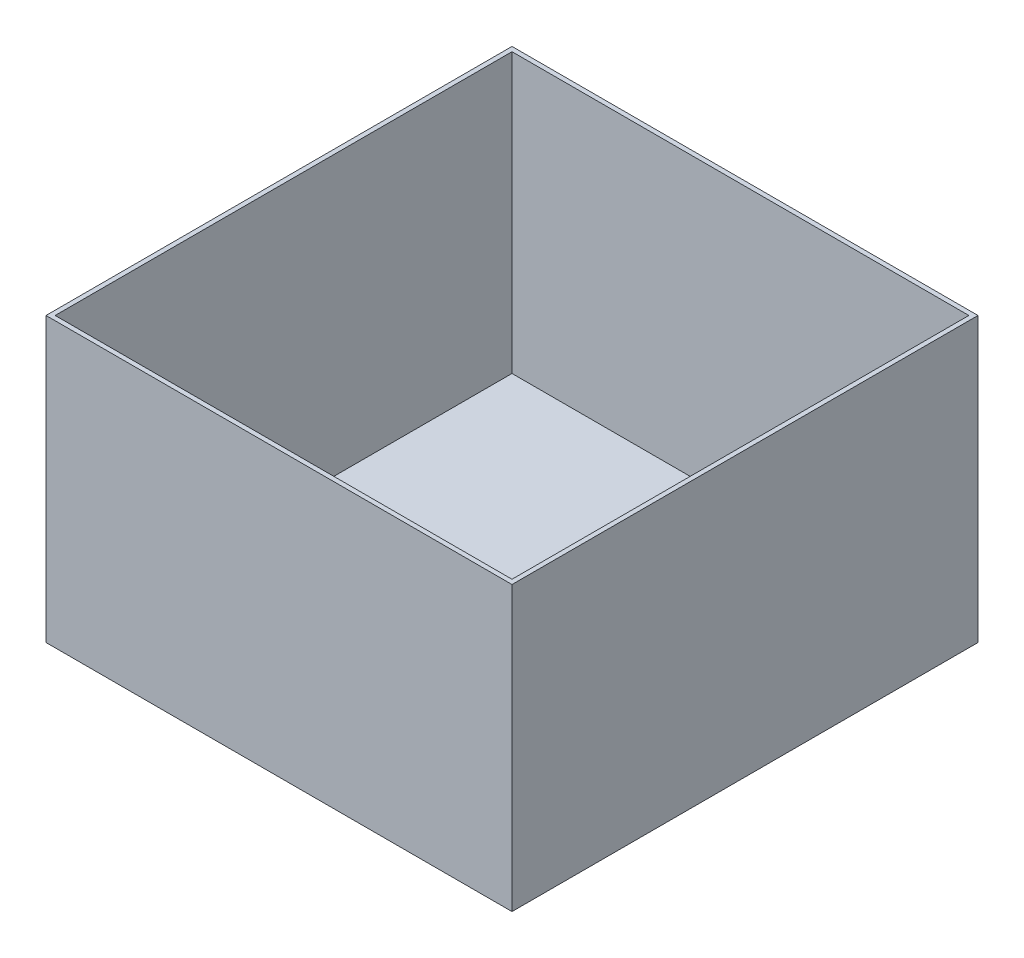
ISO-10303-21;
HEADER;
FILE_DESCRIPTION(('STEP AP214'),'2;1');
FILE_NAME('part.step','',(''),(''),'','','');
FILE_SCHEMA(('AUTOMOTIVE_DESIGN { 1 0 10303 214 1 1 1 1 }'));
ENDSEC;
DATA;
#1=APPLICATION_CONTEXT('core data for automotive mechanical design processes');
#2=APPLICATION_PROTOCOL_DEFINITION('international standard','automotive_design',2000,#1);
#3=PRODUCT_CONTEXT('',#1,'mechanical');
#4=PRODUCT('Part','Part','',(#3));
#5=PRODUCT_RELATED_PRODUCT_CATEGORY('part','',(#4));
#6=PRODUCT_DEFINITION_FORMATION('','',#4);
#7=PRODUCT_DEFINITION_CONTEXT('part definition',#1,'design');
#8=PRODUCT_DEFINITION('design','',#6,#7);
#9=PRODUCT_DEFINITION_SHAPE('','',#8);
#10=(LENGTH_UNIT() NAMED_UNIT(*) SI_UNIT(.MILLI.,.METRE.));
#11=(NAMED_UNIT(*) PLANE_ANGLE_UNIT() SI_UNIT($,.RADIAN.));
#12=(NAMED_UNIT(*) SI_UNIT($,.STERADIAN.) SOLID_ANGLE_UNIT());
#13=UNCERTAINTY_MEASURE_WITH_UNIT(LENGTH_MEASURE(1.E-05),#10,'distance_accuracy_value','');
#14=(GEOMETRIC_REPRESENTATION_CONTEXT(3) GLOBAL_UNCERTAINTY_ASSIGNED_CONTEXT((#13)) GLOBAL_UNIT_ASSIGNED_CONTEXT((#10,
#11,#12)) REPRESENTATION_CONTEXT('',''));
#15=CARTESIAN_POINT('',(0.,0.,0.));
#16=DIRECTION('',(0.,0.,1.));
#17=DIRECTION('',(1.,0.,0.));
#18=AXIS2_PLACEMENT_3D('',#15,#16,#17);
#19=CARTESIAN_POINT('',(0.,31.,0.));
#20=DIRECTION('',(0.,-1.,0.));
#21=DIRECTION('',(0.,0.,-1.));
#22=AXIS2_PLACEMENT_3D('',#19,#20,#21);
#23=PLANE('',#22);
#24=DIRECTION('',(0.,0.,-1.));
#25=VECTOR('',#24,1.);
#26=CARTESIAN_POINT('',(51.,31.,51.));
#27=LINE('',#26,#25);
#28=CARTESIAN_POINT('',(51.,31.,51.));
#29=VERTEX_POINT('',#28);
#30=CARTESIAN_POINT('',(51.,31.,-51.));
#31=VERTEX_POINT('',#30);
#32=EDGE_CURVE('E147',#29,#31,#27,.T.);
#33=ORIENTED_EDGE('',*,*,#32,.T.);
#34=DIRECTION('',(-1.,0.,0.));
#35=VECTOR('',#34,1.);
#36=CARTESIAN_POINT('',(-51.,31.,-51.));
#37=LINE('',#36,#35);
#38=CARTESIAN_POINT('',(-51.,31.,-51.));
#39=VERTEX_POINT('',#38);
#40=EDGE_CURVE('E91',#31,#39,#37,.T.);
#41=ORIENTED_EDGE('',*,*,#40,.T.);
#42=DIRECTION('',(0.,0.,1.));
#43=VECTOR('',#42,1.);
#44=CARTESIAN_POINT('',(-51.,31.,51.));
#45=LINE('',#44,#43);
#46=CARTESIAN_POINT('',(-51.,31.,51.));
#47=VERTEX_POINT('',#46);
#48=EDGE_CURVE('E150',#39,#47,#45,.T.);
#49=ORIENTED_EDGE('',*,*,#48,.T.);
#50=DIRECTION('',(1.,0.,0.));
#51=VECTOR('',#50,1.);
#52=CARTESIAN_POINT('',(-51.,31.,51.));
#53=LINE('',#52,#51);
#54=EDGE_CURVE('E63',#47,#29,#53,.T.);
#55=ORIENTED_EDGE('',*,*,#54,.T.);
#56=EDGE_LOOP('',(#33,#41,#49,#55));
#57=FACE_BOUND('',#56,.T.);
#58=DIRECTION('',(0.,0.,-1.));
#59=VECTOR('',#58,1.);
#60=CARTESIAN_POINT('',(50.,31.,0.));
#61=LINE('',#60,#59);
#62=CARTESIAN_POINT('',(50.,31.,50.));
#63=VERTEX_POINT('',#62);
#64=CARTESIAN_POINT('',(50.,31.,-50.));
#65=VERTEX_POINT('',#64);
#66=EDGE_CURVE('E136',#63,#65,#61,.T.);
#67=ORIENTED_EDGE('',*,*,#66,.F.);
#68=DIRECTION('',(1.,0.,0.));
#69=VECTOR('',#68,1.);
#70=CARTESIAN_POINT('',(0.,31.,50.));
#71=LINE('',#70,#69);
#72=CARTESIAN_POINT('',(-50.,31.,50.));
#73=VERTEX_POINT('',#72);
#74=EDGE_CURVE('E145',#73,#63,#71,.T.);
#75=ORIENTED_EDGE('',*,*,#74,.F.);
#76=DIRECTION('',(0.,0.,1.));
#77=VECTOR('',#76,1.);
#78=CARTESIAN_POINT('',(-50.,31.,0.));
#79=LINE('',#78,#77);
#80=CARTESIAN_POINT('',(-50.,31.,-50.));
#81=VERTEX_POINT('',#80);
#82=EDGE_CURVE('E143',#81,#73,#79,.T.);
#83=ORIENTED_EDGE('',*,*,#82,.F.);
#84=DIRECTION('',(-1.,0.,0.));
#85=VECTOR('',#84,1.);
#86=CARTESIAN_POINT('',(0.,31.,-50.));
#87=LINE('',#86,#85);
#88=EDGE_CURVE('E128',#65,#81,#87,.T.);
#89=ORIENTED_EDGE('',*,*,#88,.F.);
#90=EDGE_LOOP('',(#67,#75,#83,#89));
#91=FACE_BOUND('',#90,.T.);
#92=ADVANCED_FACE('F39',(#57,#91),#23,.F.);
#93=CARTESIAN_POINT('',(51.,31.,51.));
#94=DIRECTION('',(-1.,0.,0.));
#95=DIRECTION('',(0.,0.,1.));
#96=AXIS2_PLACEMENT_3D('',#93,#94,#95);
#97=PLANE('',#96);
#98=DIRECTION('',(0.,0.,-1.));
#99=VECTOR('',#98,1.);
#100=CARTESIAN_POINT('',(51.,-31.,51.));
#101=LINE('',#100,#99);
#102=CARTESIAN_POINT('',(51.,-31.,51.));
#103=VERTEX_POINT('',#102);
#104=CARTESIAN_POINT('',(51.,-31.,-51.));
#105=VERTEX_POINT('',#104);
#106=EDGE_CURVE('E154',#103,#105,#101,.T.);
#107=ORIENTED_EDGE('',*,*,#106,.T.);
#108=DIRECTION('',(0.,-1.,0.));
#109=VECTOR('',#108,1.);
#110=CARTESIAN_POINT('',(51.,31.,-51.));
#111=LINE('',#110,#109);
#112=EDGE_CURVE('E11',#31,#105,#111,.T.);
#113=ORIENTED_EDGE('',*,*,#112,.F.);
#114=ORIENTED_EDGE('',*,*,#32,.F.);
#115=DIRECTION('',(0.,-1.,0.));
#116=VECTOR('',#115,1.);
#117=CARTESIAN_POINT('',(51.,31.,51.));
#118=LINE('',#117,#116);
#119=EDGE_CURVE('E153',#29,#103,#118,.T.);
#120=ORIENTED_EDGE('',*,*,#119,.T.);
#121=EDGE_LOOP('',(#107,#113,#114,#120));
#122=FACE_BOUND('',#121,.T.);
#123=ADVANCED_FACE('F41',(#122),#97,.F.);
#124=CARTESIAN_POINT('',(-51.,31.,-51.));
#125=DIRECTION('',(0.,0.,1.));
#126=DIRECTION('',(1.,0.,0.));
#127=AXIS2_PLACEMENT_3D('',#124,#125,#126);
#128=PLANE('',#127);
#129=DIRECTION('',(-1.,0.,0.));
#130=VECTOR('',#129,1.);
#131=CARTESIAN_POINT('',(-51.,-31.,-51.));
#132=LINE('',#131,#130);
#133=CARTESIAN_POINT('',(-51.,-31.,-51.));
#134=VERTEX_POINT('',#133);
#135=EDGE_CURVE('E157',#105,#134,#132,.T.);
#136=ORIENTED_EDGE('',*,*,#135,.T.);
#137=DIRECTION('',(0.,-1.,0.));
#138=VECTOR('',#137,1.);
#139=CARTESIAN_POINT('',(-51.,31.,-51.));
#140=LINE('',#139,#138);
#141=EDGE_CURVE('E47',#39,#134,#140,.T.);
#142=ORIENTED_EDGE('',*,*,#141,.F.);
#143=ORIENTED_EDGE('',*,*,#40,.F.);
#144=ORIENTED_EDGE('',*,*,#112,.T.);
#145=EDGE_LOOP('',(#136,#142,#143,#144));
#146=FACE_BOUND('',#145,.T.);
#147=ADVANCED_FACE('F186',(#146),#128,.F.);
#148=CARTESIAN_POINT('',(-51.,31.,51.));
#149=DIRECTION('',(1.,0.,0.));
#150=DIRECTION('',(0.,0.,-1.));
#151=AXIS2_PLACEMENT_3D('',#148,#149,#150);
#152=PLANE('',#151);
#153=DIRECTION('',(0.,0.,1.));
#154=VECTOR('',#153,1.);
#155=CARTESIAN_POINT('',(-51.,-31.,51.));
#156=LINE('',#155,#154);
#157=CARTESIAN_POINT('',(-51.,-31.,51.));
#158=VERTEX_POINT('',#157);
#159=EDGE_CURVE('E159',#134,#158,#156,.T.);
#160=ORIENTED_EDGE('',*,*,#159,.T.);
#161=DIRECTION('',(0.,-1.,0.));
#162=VECTOR('',#161,1.);
#163=CARTESIAN_POINT('',(-51.,31.,51.));
#164=LINE('',#163,#162);
#165=EDGE_CURVE('E163',#47,#158,#164,.T.);
#166=ORIENTED_EDGE('',*,*,#165,.F.);
#167=ORIENTED_EDGE('',*,*,#48,.F.);
#168=ORIENTED_EDGE('',*,*,#141,.T.);
#169=EDGE_LOOP('',(#160,#166,#167,#168));
#170=FACE_BOUND('',#169,.T.);
#171=ADVANCED_FACE('F168',(#170),#152,.F.);
#172=CARTESIAN_POINT('',(-51.,31.,51.));
#173=DIRECTION('',(0.,0.,-1.));
#174=DIRECTION('',(-1.,0.,0.));
#175=AXIS2_PLACEMENT_3D('',#172,#173,#174);
#176=PLANE('',#175);
#177=DIRECTION('',(1.,0.,0.));
#178=VECTOR('',#177,1.);
#179=CARTESIAN_POINT('',(-51.,-31.,51.));
#180=LINE('',#179,#178);
#181=EDGE_CURVE('E84',#158,#103,#180,.T.);
#182=ORIENTED_EDGE('',*,*,#181,.T.);
#183=ORIENTED_EDGE('',*,*,#119,.F.);
#184=ORIENTED_EDGE('',*,*,#54,.F.);
#185=ORIENTED_EDGE('',*,*,#165,.T.);
#186=EDGE_LOOP('',(#182,#183,#184,#185));
#187=FACE_BOUND('',#186,.T.);
#188=ADVANCED_FACE('F176',(#187),#176,.F.);
#189=CARTESIAN_POINT('',(0.,-31.,0.));
#190=DIRECTION('',(0.,-1.,0.));
#191=DIRECTION('',(0.,0.,-1.));
#192=AXIS2_PLACEMENT_3D('',#189,#190,#191);
#193=PLANE('',#192);
#194=ORIENTED_EDGE('',*,*,#106,.F.);
#195=ORIENTED_EDGE('',*,*,#181,.F.);
#196=ORIENTED_EDGE('',*,*,#159,.F.);
#197=ORIENTED_EDGE('',*,*,#135,.F.);
#198=EDGE_LOOP('',(#194,#195,#196,#197));
#199=FACE_BOUND('',#198,.T.);
#200=ADVANCED_FACE('F172',(#199),#193,.T.);
#201=CARTESIAN_POINT('',(50.,31.,51.));
#202=DIRECTION('',(-1.,0.,0.));
#203=DIRECTION('',(0.,0.,1.));
#204=AXIS2_PLACEMENT_3D('',#201,#202,#203);
#205=PLANE('',#204);
#206=DIRECTION('',(0.,0.,-1.));
#207=VECTOR('',#206,1.);
#208=CARTESIAN_POINT('',(50.,-30.,0.));
#209=LINE('',#208,#207);
#210=CARTESIAN_POINT('',(50.,-30.,50.));
#211=VERTEX_POINT('',#210);
#212=CARTESIAN_POINT('',(50.,-30.,-50.));
#213=VERTEX_POINT('',#212);
#214=EDGE_CURVE('E119',#211,#213,#209,.T.);
#215=ORIENTED_EDGE('',*,*,#214,.F.);
#216=DIRECTION('',(0.,-1.,0.));
#217=VECTOR('',#216,1.);
#218=CARTESIAN_POINT('',(50.,31.,50.));
#219=LINE('',#218,#217);
#220=EDGE_CURVE('E139',#63,#211,#219,.T.);
#221=ORIENTED_EDGE('',*,*,#220,.F.);
#222=ORIENTED_EDGE('',*,*,#66,.T.);
#223=DIRECTION('',(0.,-1.,0.));
#224=VECTOR('',#223,1.);
#225=CARTESIAN_POINT('',(50.,31.,-50.));
#226=LINE('',#225,#224);
#227=EDGE_CURVE('E131',#65,#213,#226,.T.);
#228=ORIENTED_EDGE('',*,*,#227,.T.);
#229=EDGE_LOOP('',(#215,#221,#222,#228));
#230=FACE_BOUND('',#229,.T.);
#231=ADVANCED_FACE('F184',(#230),#205,.T.);
#232=CARTESIAN_POINT('',(-51.,31.,-50.));
#233=DIRECTION('',(0.,0.,1.));
#234=DIRECTION('',(1.,0.,0.));
#235=AXIS2_PLACEMENT_3D('',#232,#233,#234);
#236=PLANE('',#235);
#237=DIRECTION('',(-1.,0.,0.));
#238=VECTOR('',#237,1.);
#239=CARTESIAN_POINT('',(0.,-30.,-50.));
#240=LINE('',#239,#238);
#241=CARTESIAN_POINT('',(-50.,-30.,-50.));
#242=VERTEX_POINT('',#241);
#243=EDGE_CURVE('E113',#213,#242,#240,.T.);
#244=ORIENTED_EDGE('',*,*,#243,.F.);
#245=ORIENTED_EDGE('',*,*,#227,.F.);
#246=ORIENTED_EDGE('',*,*,#88,.T.);
#247=DIRECTION('',(0.,-1.,0.));
#248=VECTOR('',#247,1.);
#249=CARTESIAN_POINT('',(-50.,31.,-50.));
#250=LINE('',#249,#248);
#251=EDGE_CURVE('E125',#81,#242,#250,.T.);
#252=ORIENTED_EDGE('',*,*,#251,.T.);
#253=EDGE_LOOP('',(#244,#245,#246,#252));
#254=FACE_BOUND('',#253,.T.);
#255=ADVANCED_FACE('F126',(#254),#236,.T.);
#256=CARTESIAN_POINT('',(-50.,31.,51.));
#257=DIRECTION('',(1.,0.,0.));
#258=DIRECTION('',(0.,0.,-1.));
#259=AXIS2_PLACEMENT_3D('',#256,#257,#258);
#260=PLANE('',#259);
#261=DIRECTION('',(0.,0.,1.));
#262=VECTOR('',#261,1.);
#263=CARTESIAN_POINT('',(-50.,-30.,0.));
#264=LINE('',#263,#262);
#265=CARTESIAN_POINT('',(-50.,-30.,50.));
#266=VERTEX_POINT('',#265);
#267=EDGE_CURVE('E117',#242,#266,#264,.T.);
#268=ORIENTED_EDGE('',*,*,#267,.F.);
#269=ORIENTED_EDGE('',*,*,#251,.F.);
#270=ORIENTED_EDGE('',*,*,#82,.T.);
#271=DIRECTION('',(0.,-1.,0.));
#272=VECTOR('',#271,1.);
#273=CARTESIAN_POINT('',(-50.,31.,50.));
#274=LINE('',#273,#272);
#275=EDGE_CURVE('E54',#73,#266,#274,.T.);
#276=ORIENTED_EDGE('',*,*,#275,.T.);
#277=EDGE_LOOP('',(#268,#269,#270,#276));
#278=FACE_BOUND('',#277,.T.);
#279=ADVANCED_FACE('F133',(#278),#260,.T.);
#280=CARTESIAN_POINT('',(-51.,31.,50.));
#281=DIRECTION('',(0.,0.,-1.));
#282=DIRECTION('',(-1.,0.,0.));
#283=AXIS2_PLACEMENT_3D('',#280,#281,#282);
#284=PLANE('',#283);
#285=DIRECTION('',(1.,0.,0.));
#286=VECTOR('',#285,1.);
#287=CARTESIAN_POINT('',(0.,-30.,50.));
#288=LINE('',#287,#286);
#289=EDGE_CURVE('E134',#266,#211,#288,.T.);
#290=ORIENTED_EDGE('',*,*,#289,.F.);
#291=ORIENTED_EDGE('',*,*,#275,.F.);
#292=ORIENTED_EDGE('',*,*,#74,.T.);
#293=ORIENTED_EDGE('',*,*,#220,.T.);
#294=EDGE_LOOP('',(#290,#291,#292,#293));
#295=FACE_BOUND('',#294,.T.);
#296=ADVANCED_FACE('F198',(#295),#284,.T.);
#297=CARTESIAN_POINT('',(0.,-30.,0.));
#298=DIRECTION('',(0.,-1.,0.));
#299=DIRECTION('',(0.,0.,-1.));
#300=AXIS2_PLACEMENT_3D('',#297,#298,#299);
#301=PLANE('',#300);
#302=ORIENTED_EDGE('',*,*,#214,.T.);
#303=ORIENTED_EDGE('',*,*,#243,.T.);
#304=ORIENTED_EDGE('',*,*,#267,.T.);
#305=ORIENTED_EDGE('',*,*,#289,.T.);
#306=EDGE_LOOP('',(#302,#303,#304,#305));
#307=FACE_BOUND('',#306,.T.);
#308=ADVANCED_FACE('F115',(#307),#301,.F.);
#309=CLOSED_SHELL('',(#92,#123,#147,#171,#188,#200,#231,#255,#279,#296,#308));
#310=MANIFOLD_SOLID_BREP('B2',#309);
#311=ADVANCED_BREP_SHAPE_REPRESENTATION('',(#18,#310),#14);
#312=SHAPE_DEFINITION_REPRESENTATION(#9,#311);
ENDSEC;
END-ISO-10303-21;
